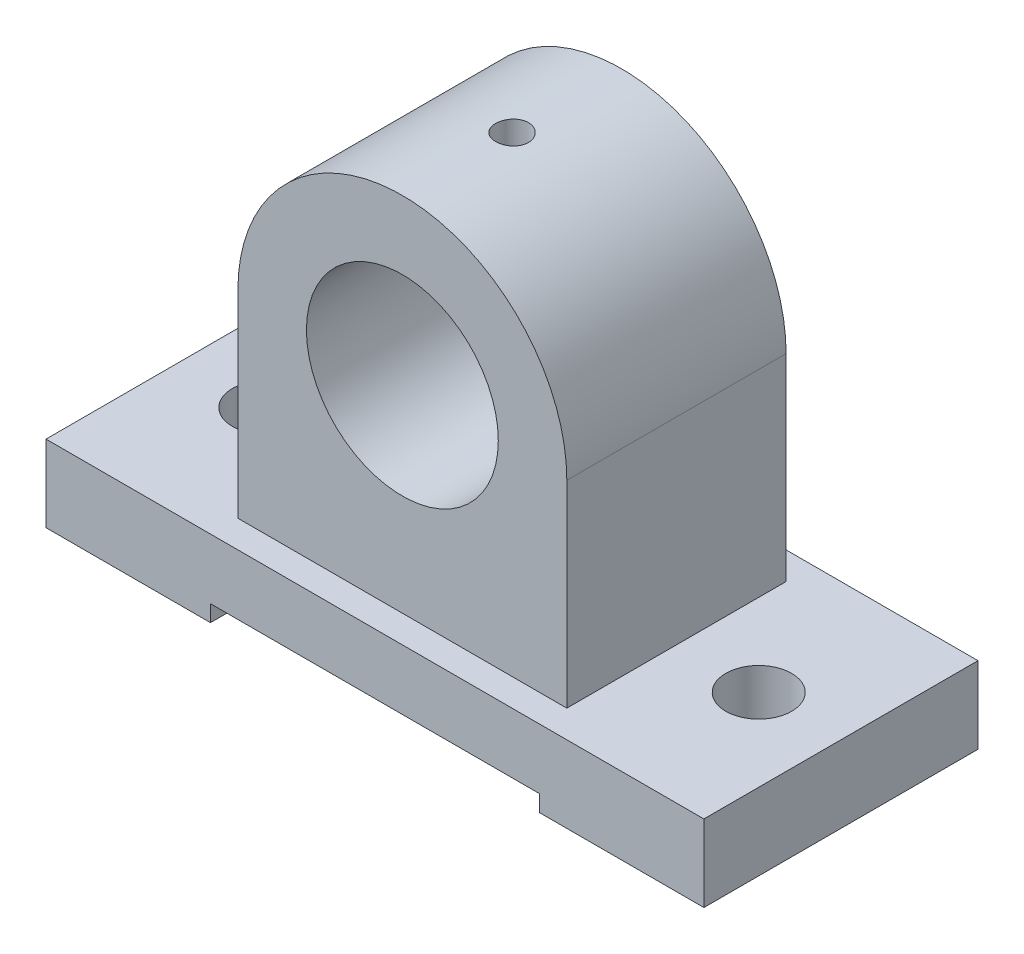
ISO-10303-21;
HEADER;
FILE_DESCRIPTION(('STEP AP214'),'2;1');
FILE_NAME('part.step','',(''),(''),'','','');
FILE_SCHEMA(('AUTOMOTIVE_DESIGN { 1 0 10303 214 1 1 1 1 }'));
ENDSEC;
DATA;
#1=APPLICATION_CONTEXT('core data for automotive mechanical design processes');
#2=APPLICATION_PROTOCOL_DEFINITION('international standard','automotive_design',2000,#1);
#3=PRODUCT_CONTEXT('',#1,'mechanical');
#4=PRODUCT('Part','Part','',(#3));
#5=PRODUCT_RELATED_PRODUCT_CATEGORY('part','',(#4));
#6=PRODUCT_DEFINITION_FORMATION('','',#4);
#7=PRODUCT_DEFINITION_CONTEXT('part definition',#1,'design');
#8=PRODUCT_DEFINITION('design','',#6,#7);
#9=PRODUCT_DEFINITION_SHAPE('','',#8);
#10=(LENGTH_UNIT() NAMED_UNIT(*) SI_UNIT(.MILLI.,.METRE.));
#11=(NAMED_UNIT(*) PLANE_ANGLE_UNIT() SI_UNIT($,.RADIAN.));
#12=(NAMED_UNIT(*) SI_UNIT($,.STERADIAN.) SOLID_ANGLE_UNIT());
#13=UNCERTAINTY_MEASURE_WITH_UNIT(LENGTH_MEASURE(1.E-05),#10,'distance_accuracy_value','');
#14=(GEOMETRIC_REPRESENTATION_CONTEXT(3) GLOBAL_UNCERTAINTY_ASSIGNED_CONTEXT((#13)) GLOBAL_UNIT_ASSIGNED_CONTEXT((#10,
#11,#12)) REPRESENTATION_CONTEXT('',''));
#15=CARTESIAN_POINT('',(0.,0.,0.));
#16=DIRECTION('',(0.,0.,1.));
#17=DIRECTION('',(1.,0.,0.));
#18=AXIS2_PLACEMENT_3D('',#15,#16,#17);
#19=CARTESIAN_POINT('',(60.,14.,25.));
#20=DIRECTION('',(0.,0.,-1.));
#21=DIRECTION('',(-1.,0.,0.));
#22=AXIS2_PLACEMENT_3D('',#19,#20,#21);
#23=PLANE('',#22);
#24=DIRECTION('',(0.,-1.,0.));
#25=VECTOR('',#24,1.);
#26=CARTESIAN_POINT('',(-30.,3.,25.));
#27=LINE('',#26,#25);
#28=CARTESIAN_POINT('',(-30.,3.,25.));
#29=VERTEX_POINT('',#28);
#30=CARTESIAN_POINT('',(-30.,0.,25.));
#31=VERTEX_POINT('',#30);
#32=EDGE_CURVE('E165',#29,#31,#27,.T.);
#33=ORIENTED_EDGE('',*,*,#32,.F.);
#34=DIRECTION('',(1.,0.,0.));
#35=VECTOR('',#34,1.);
#36=CARTESIAN_POINT('',(30.,3.,25.));
#37=LINE('',#36,#35);
#38=CARTESIAN_POINT('',(30.,3.,25.));
#39=VERTEX_POINT('',#38);
#40=EDGE_CURVE('E151',#29,#39,#37,.T.);
#41=ORIENTED_EDGE('',*,*,#40,.T.);
#42=DIRECTION('',(0.,-1.,0.));
#43=VECTOR('',#42,1.);
#44=CARTESIAN_POINT('',(30.,3.,25.));
#45=LINE('',#44,#43);
#46=CARTESIAN_POINT('',(30.,0.,25.));
#47=VERTEX_POINT('',#46);
#48=EDGE_CURVE('E176',#39,#47,#45,.T.);
#49=ORIENTED_EDGE('',*,*,#48,.T.);
#50=DIRECTION('',(1.,0.,0.));
#51=VECTOR('',#50,1.);
#52=CARTESIAN_POINT('',(60.,0.,25.));
#53=LINE('',#52,#51);
#54=CARTESIAN_POINT('',(60.,0.,25.));
#55=VERTEX_POINT('',#54);
#56=EDGE_CURVE('E247',#47,#55,#53,.T.);
#57=ORIENTED_EDGE('',*,*,#56,.T.);
#58=DIRECTION('',(0.,-1.,0.));
#59=VECTOR('',#58,1.);
#60=CARTESIAN_POINT('',(60.,14.,25.));
#61=LINE('',#60,#59);
#62=CARTESIAN_POINT('',(60.,14.,25.));
#63=VERTEX_POINT('',#62);
#64=EDGE_CURVE('E67',#63,#55,#61,.T.);
#65=ORIENTED_EDGE('',*,*,#64,.F.);
#66=DIRECTION('',(1.,0.,0.));
#67=VECTOR('',#66,1.);
#68=CARTESIAN_POINT('',(60.,14.,25.));
#69=LINE('',#68,#67);
#70=CARTESIAN_POINT('',(-60.,14.,25.));
#71=VERTEX_POINT('',#70);
#72=EDGE_CURVE('E234',#71,#63,#69,.T.);
#73=ORIENTED_EDGE('',*,*,#72,.F.);
#74=DIRECTION('',(0.,-1.,0.));
#75=VECTOR('',#74,1.);
#76=CARTESIAN_POINT('',(-60.,14.,25.));
#77=LINE('',#76,#75);
#78=CARTESIAN_POINT('',(-60.,0.,25.));
#79=VERTEX_POINT('',#78);
#80=EDGE_CURVE('E11',#71,#79,#77,.T.);
#81=ORIENTED_EDGE('',*,*,#80,.T.);
#82=EDGE_CURVE('E173',#79,#31,#53,.T.);
#83=ORIENTED_EDGE('',*,*,#82,.T.);
#84=EDGE_LOOP('',(#33,#41,#49,#57,#65,#73,#81,#83));
#85=FACE_BOUND('',#84,.T.);
#86=ADVANCED_FACE('F51',(#85),#23,.F.);
#87=CARTESIAN_POINT('',(-60.,14.,-25.));
#88=DIRECTION('',(0.,0.,1.));
#89=DIRECTION('',(1.,0.,0.));
#90=AXIS2_PLACEMENT_3D('',#87,#88,#89);
#91=PLANE('',#90);
#92=DIRECTION('',(0.,-1.,0.));
#93=VECTOR('',#92,1.);
#94=CARTESIAN_POINT('',(-30.,3.,-25.));
#95=LINE('',#94,#93);
#96=CARTESIAN_POINT('',(-30.,3.,-25.));
#97=VERTEX_POINT('',#96);
#98=CARTESIAN_POINT('',(-30.,0.,-25.));
#99=VERTEX_POINT('',#98);
#100=EDGE_CURVE('E168',#97,#99,#95,.T.);
#101=ORIENTED_EDGE('',*,*,#100,.T.);
#102=DIRECTION('',(-1.,0.,0.));
#103=VECTOR('',#102,1.);
#104=CARTESIAN_POINT('',(-60.,0.,-25.));
#105=LINE('',#104,#103);
#106=CARTESIAN_POINT('',(-60.,0.,-25.));
#107=VERTEX_POINT('',#106);
#108=EDGE_CURVE('E253',#99,#107,#105,.T.);
#109=ORIENTED_EDGE('',*,*,#108,.T.);
#110=DIRECTION('',(0.,-1.,0.));
#111=VECTOR('',#110,1.);
#112=CARTESIAN_POINT('',(-60.,14.,-25.));
#113=LINE('',#112,#111);
#114=CARTESIAN_POINT('',(-60.,14.,-25.));
#115=VERTEX_POINT('',#114);
#116=EDGE_CURVE('E243',#115,#107,#113,.T.);
#117=ORIENTED_EDGE('',*,*,#116,.F.);
#118=DIRECTION('',(-1.,0.,0.));
#119=VECTOR('',#118,1.);
#120=CARTESIAN_POINT('',(-60.,14.,-25.));
#121=LINE('',#120,#119);
#122=CARTESIAN_POINT('',(60.,14.,-25.));
#123=VERTEX_POINT('',#122);
#124=EDGE_CURVE('E240',#123,#115,#121,.T.);
#125=ORIENTED_EDGE('',*,*,#124,.F.);
#126=DIRECTION('',(0.,-1.,0.));
#127=VECTOR('',#126,1.);
#128=CARTESIAN_POINT('',(60.,14.,-25.));
#129=LINE('',#128,#127);
#130=CARTESIAN_POINT('',(60.,0.,-25.));
#131=VERTEX_POINT('',#130);
#132=EDGE_CURVE('E260',#123,#131,#129,.T.);
#133=ORIENTED_EDGE('',*,*,#132,.T.);
#134=CARTESIAN_POINT('',(30.,0.,-25.));
#135=VERTEX_POINT('',#134);
#136=EDGE_CURVE('E235',#131,#135,#105,.T.);
#137=ORIENTED_EDGE('',*,*,#136,.T.);
#138=DIRECTION('',(0.,-1.,0.));
#139=VECTOR('',#138,1.);
#140=CARTESIAN_POINT('',(30.,3.,-25.));
#141=LINE('',#140,#139);
#142=CARTESIAN_POINT('',(30.,3.,-25.));
#143=VERTEX_POINT('',#142);
#144=EDGE_CURVE('E75',#143,#135,#141,.T.);
#145=ORIENTED_EDGE('',*,*,#144,.F.);
#146=DIRECTION('',(-1.,0.,0.));
#147=VECTOR('',#146,1.);
#148=CARTESIAN_POINT('',(-30.,3.,-25.));
#149=LINE('',#148,#147);
#150=EDGE_CURVE('E301',#143,#97,#149,.T.);
#151=ORIENTED_EDGE('',*,*,#150,.T.);
#152=EDGE_LOOP('',(#101,#109,#117,#125,#133,#137,#145,#151));
#153=FACE_BOUND('',#152,.T.);
#154=ADVANCED_FACE('F278',(#153),#91,.F.);
#155=CARTESIAN_POINT('',(0.,0.,0.));
#156=DIRECTION('',(0.,-1.,0.));
#157=DIRECTION('',(0.,0.,-1.));
#158=AXIS2_PLACEMENT_3D('',#155,#156,#157);
#159=PLANE('',#158);
#160=CARTESIAN_POINT('',(-45.,0.,0.));
#161=DIRECTION('',(0.,1.,0.));
#162=DIRECTION('',(0.,0.,1.));
#163=AXIS2_PLACEMENT_3D('',#160,#161,#162);
#164=CIRCLE('',#163,6.);
#165=CARTESIAN_POINT('',(-45.,0.,6.));
#166=VERTEX_POINT('',#165);
#167=EDGE_CURVE('E292',#166,#166,#164,.T.);
#168=ORIENTED_EDGE('',*,*,#167,.T.);
#169=EDGE_LOOP('',(#168));
#170=FACE_BOUND('',#169,.T.);
#171=ORIENTED_EDGE('',*,*,#108,.F.);
#172=DIRECTION('',(0.,0.,1.));
#173=VECTOR('',#172,1.);
#174=CARTESIAN_POINT('',(-30.,0.,25.));
#175=LINE('',#174,#173);
#176=EDGE_CURVE('E290',#99,#31,#175,.T.);
#177=ORIENTED_EDGE('',*,*,#176,.T.);
#178=ORIENTED_EDGE('',*,*,#82,.F.);
#179=DIRECTION('',(0.,0.,1.));
#180=VECTOR('',#179,1.);
#181=CARTESIAN_POINT('',(-60.,0.,25.));
#182=LINE('',#181,#180);
#183=EDGE_CURVE('E229',#107,#79,#182,.T.);
#184=ORIENTED_EDGE('',*,*,#183,.F.);
#185=EDGE_LOOP('',(#171,#177,#178,#184));
#186=FACE_BOUND('',#185,.T.);
#187=ADVANCED_FACE('F289',(#170,#186),#159,.T.);
#188=CARTESIAN_POINT('',(45.,0.,0.));
#189=DIRECTION('',(0.,1.,0.));
#190=DIRECTION('',(0.,0.,1.));
#191=AXIS2_PLACEMENT_3D('',#188,#189,#190);
#192=CIRCLE('',#191,6.);
#193=CARTESIAN_POINT('',(45.,0.,6.));
#194=VERTEX_POINT('',#193);
#195=EDGE_CURVE('E309',#194,#194,#192,.T.);
#196=ORIENTED_EDGE('',*,*,#195,.T.);
#197=EDGE_LOOP('',(#196));
#198=FACE_BOUND('',#197,.T.);
#199=ORIENTED_EDGE('',*,*,#56,.F.);
#200=DIRECTION('',(0.,0.,-1.));
#201=VECTOR('',#200,1.);
#202=CARTESIAN_POINT('',(30.,0.,-25.));
#203=LINE('',#202,#201);
#204=EDGE_CURVE('E170',#47,#135,#203,.T.);
#205=ORIENTED_EDGE('',*,*,#204,.T.);
#206=ORIENTED_EDGE('',*,*,#136,.F.);
#207=DIRECTION('',(0.,0.,-1.));
#208=VECTOR('',#207,1.);
#209=CARTESIAN_POINT('',(60.,0.,-25.));
#210=LINE('',#209,#208);
#211=EDGE_CURVE('E250',#55,#131,#210,.T.);
#212=ORIENTED_EDGE('',*,*,#211,.F.);
#213=EDGE_LOOP('',(#199,#205,#206,#212));
#214=FACE_BOUND('',#213,.T.);
#215=ADVANCED_FACE('F276',(#198,#214),#159,.T.);
#216=CARTESIAN_POINT('',(-60.,14.,25.));
#217=DIRECTION('',(1.,0.,0.));
#218=DIRECTION('',(0.,0.,-1.));
#219=AXIS2_PLACEMENT_3D('',#216,#217,#218);
#220=PLANE('',#219);
#221=ORIENTED_EDGE('',*,*,#183,.T.);
#222=ORIENTED_EDGE('',*,*,#80,.F.);
#223=DIRECTION('',(0.,0.,1.));
#224=VECTOR('',#223,1.);
#225=CARTESIAN_POINT('',(-60.,14.,25.));
#226=LINE('',#225,#224);
#227=EDGE_CURVE('E230',#115,#71,#226,.T.);
#228=ORIENTED_EDGE('',*,*,#227,.F.);
#229=ORIENTED_EDGE('',*,*,#116,.T.);
#230=EDGE_LOOP('',(#221,#222,#228,#229));
#231=FACE_BOUND('',#230,.T.);
#232=ADVANCED_FACE('F54',(#231),#220,.F.);
#233=CARTESIAN_POINT('',(60.,14.,-25.));
#234=DIRECTION('',(-1.,0.,0.));
#235=DIRECTION('',(0.,0.,1.));
#236=AXIS2_PLACEMENT_3D('',#233,#234,#235);
#237=PLANE('',#236);
#238=ORIENTED_EDGE('',*,*,#211,.T.);
#239=ORIENTED_EDGE('',*,*,#132,.F.);
#240=DIRECTION('',(0.,0.,-1.));
#241=VECTOR('',#240,1.);
#242=CARTESIAN_POINT('',(60.,14.,-25.));
#243=LINE('',#242,#241);
#244=EDGE_CURVE('E237',#63,#123,#243,.T.);
#245=ORIENTED_EDGE('',*,*,#244,.F.);
#246=ORIENTED_EDGE('',*,*,#64,.T.);
#247=EDGE_LOOP('',(#238,#239,#245,#246));
#248=FACE_BOUND('',#247,.T.);
#249=ADVANCED_FACE('F271',(#248),#237,.F.);
#250=CARTESIAN_POINT('',(0.,14.,0.));
#251=DIRECTION('',(0.,-1.,0.));
#252=DIRECTION('',(0.,0.,-1.));
#253=AXIS2_PLACEMENT_3D('',#250,#251,#252);
#254=PLANE('',#253);
#255=CARTESIAN_POINT('',(-45.,14.,0.));
#256=DIRECTION('',(0.,1.,0.));
#257=DIRECTION('',(0.,0.,1.));
#258=AXIS2_PLACEMENT_3D('',#255,#256,#257);
#259=CIRCLE('',#258,6.);
#260=CARTESIAN_POINT('',(-45.,14.,6.));
#261=VERTEX_POINT('',#260);
#262=EDGE_CURVE('E298',#261,#261,#259,.T.);
#263=ORIENTED_EDGE('',*,*,#262,.F.);
#264=EDGE_LOOP('',(#263));
#265=FACE_BOUND('',#264,.T.);
#266=CARTESIAN_POINT('',(45.,14.,0.));
#267=DIRECTION('',(0.,1.,0.));
#268=DIRECTION('',(0.,0.,1.));
#269=AXIS2_PLACEMENT_3D('',#266,#267,#268);
#270=CIRCLE('',#269,6.);
#271=CARTESIAN_POINT('',(45.,14.,6.));
#272=VERTEX_POINT('',#271);
#273=EDGE_CURVE('E312',#272,#272,#270,.T.);
#274=ORIENTED_EDGE('',*,*,#273,.F.);
#275=EDGE_LOOP('',(#274));
#276=FACE_BOUND('',#275,.T.);
#277=DIRECTION('',(0.,0.,-1.));
#278=VECTOR('',#277,1.);
#279=CARTESIAN_POINT('',(-30.,14.,20.));
#280=LINE('',#279,#278);
#281=CARTESIAN_POINT('',(-30.,14.,20.));
#282=VERTEX_POINT('',#281);
#283=CARTESIAN_POINT('',(-30.,14.,-20.));
#284=VERTEX_POINT('',#283);
#285=EDGE_CURVE('E204',#282,#284,#280,.T.);
#286=ORIENTED_EDGE('',*,*,#285,.T.);
#287=DIRECTION('',(1.,0.,0.));
#288=VECTOR('',#287,1.);
#289=CARTESIAN_POINT('',(30.,14.,-20.));
#290=LINE('',#289,#288);
#291=CARTESIAN_POINT('',(30.,14.,-20.));
#292=VERTEX_POINT('',#291);
#293=EDGE_CURVE('E83',#284,#292,#290,.T.);
#294=ORIENTED_EDGE('',*,*,#293,.T.);
#295=DIRECTION('',(0.,0.,-1.));
#296=VECTOR('',#295,1.);
#297=CARTESIAN_POINT('',(30.,14.,20.));
#298=LINE('',#297,#296);
#299=CARTESIAN_POINT('',(30.,14.,20.));
#300=VERTEX_POINT('',#299);
#301=EDGE_CURVE('E225',#300,#292,#298,.T.);
#302=ORIENTED_EDGE('',*,*,#301,.F.);
#303=DIRECTION('',(1.,0.,0.));
#304=VECTOR('',#303,1.);
#305=CARTESIAN_POINT('',(30.,14.,20.));
#306=LINE('',#305,#304);
#307=EDGE_CURVE('E190',#282,#300,#306,.T.);
#308=ORIENTED_EDGE('',*,*,#307,.F.);
#309=EDGE_LOOP('',(#286,#294,#302,#308));
#310=FACE_BOUND('',#309,.T.);
#311=ORIENTED_EDGE('',*,*,#227,.T.);
#312=ORIENTED_EDGE('',*,*,#72,.T.);
#313=ORIENTED_EDGE('',*,*,#244,.T.);
#314=ORIENTED_EDGE('',*,*,#124,.T.);
#315=EDGE_LOOP('',(#311,#312,#313,#314));
#316=FACE_BOUND('',#315,.T.);
#317=ADVANCED_FACE('F283',(#265,#276,#310,#316),#254,.F.);
#318=CARTESIAN_POINT('',(30.,50.,20.));
#319=DIRECTION('',(-1.,0.,0.));
#320=DIRECTION('',(0.,0.,1.));
#321=AXIS2_PLACEMENT_3D('',#318,#319,#320);
#322=PLANE('',#321);
#323=DIRECTION('',(0.,1.,0.));
#324=VECTOR('',#323,1.);
#325=CARTESIAN_POINT('',(30.,50.,-20.));
#326=LINE('',#325,#324);
#327=CARTESIAN_POINT('',(30.,50.,-20.));
#328=VERTEX_POINT('',#327);
#329=EDGE_CURVE('E207',#292,#328,#326,.T.);
#330=ORIENTED_EDGE('',*,*,#329,.T.);
#331=DIRECTION('',(0.,0.,-1.));
#332=VECTOR('',#331,1.);
#333=CARTESIAN_POINT('',(30.,50.,20.));
#334=LINE('',#333,#332);
#335=CARTESIAN_POINT('',(30.,50.,20.));
#336=VERTEX_POINT('',#335);
#337=EDGE_CURVE('E221',#336,#328,#334,.T.);
#338=ORIENTED_EDGE('',*,*,#337,.F.);
#339=DIRECTION('',(0.,1.,0.));
#340=VECTOR('',#339,1.);
#341=CARTESIAN_POINT('',(30.,50.,20.));
#342=LINE('',#341,#340);
#343=EDGE_CURVE('E194',#300,#336,#342,.T.);
#344=ORIENTED_EDGE('',*,*,#343,.F.);
#345=ORIENTED_EDGE('',*,*,#301,.T.);
#346=EDGE_LOOP('',(#330,#338,#344,#345));
#347=FACE_BOUND('',#346,.T.);
#348=ADVANCED_FACE('F344',(#347),#322,.F.);
#349=CARTESIAN_POINT('',(0.,50.,20.));
#350=DIRECTION('',(0.,0.,-1.));
#351=DIRECTION('',(-1.,0.,0.));
#352=AXIS2_PLACEMENT_3D('',#349,#350,#351);
#353=CYLINDRICAL_SURFACE('',#352,30.);
#354=CARTESIAN_POINT('',(0.,80.,3.));
#355=CARTESIAN_POINT('',(-0.16806106137467,79.9999980656231,2.99999272229886));
#356=CARTESIAN_POINT('',(-0.336233235503318,79.9985727678862,2.98583019331067));
#357=CARTESIAN_POINT('',(-0.667915195490509,79.9930240278421,2.92954688912872));
#358=CARTESIAN_POINT('',(-0.831419637506482,79.9888976130208,2.88739531192623));
#359=CARTESIAN_POINT('',(-1.14891502636024,79.9784124368921,2.7763732782065));
#360=CARTESIAN_POINT('',(-1.30291165384473,79.9720550240212,2.70751895844458));
#361=CARTESIAN_POINT('',(-1.59712848288122,79.9578187218292,2.54507727620507));
#362=CARTESIAN_POINT('',(-1.73735141633723,79.9499401351439,2.45149483199959));
#363=CARTESIAN_POINT('',(-2.00057865202225,79.9335123302397,2.24189190701318));
#364=CARTESIAN_POINT('',(-2.12352643450468,79.924961047216,2.1258006017939));
#365=CARTESIAN_POINT('',(-2.34822756429295,79.9081687071879,1.87462639721091));
#366=CARTESIAN_POINT('',(-2.44997993124796,79.8999276645475,1.73954261987284));
#367=CARTESIAN_POINT('',(-2.62960191133085,79.8846677465835,1.45386440494914));
#368=CARTESIAN_POINT('',(-2.70742039636464,79.8776515013272,1.30323766771542));
#369=CARTESIAN_POINT('',(-2.83663915422828,79.8656611263957,0.990973242285064));
#370=CARTESIAN_POINT('',(-2.88804007977387,79.8606869462667,0.829335826248151));
#371=CARTESIAN_POINT('',(-2.96279712480568,79.8533625221893,0.500214597401972));
#372=CARTESIAN_POINT('',(-2.98624695901139,79.8510035119429,0.332752269443376));
#373=CARTESIAN_POINT('',(-3.00472585540608,79.8491492918158,-0.0037465901873406));
#374=CARTESIAN_POINT('',(-2.9997556646124,79.8496540066624,-0.172783080366177));
#375=CARTESIAN_POINT('',(-2.96161284075803,79.853462206968,-0.506985929079954));
#376=CARTESIAN_POINT('',(-2.92854253237366,79.8567555377195,-0.672164097986082));
#377=CARTESIAN_POINT('',(-2.83529743245176,79.8657540286226,-0.994613889603282));
#378=CARTESIAN_POINT('',(-2.77512227476724,79.8714592213548,-1.15188540547509));
#379=CARTESIAN_POINT('',(-2.62926268164452,79.8846502835621,-1.45438076189667));
#380=CARTESIAN_POINT('',(-2.54353284815994,79.8921393172447,-1.59958256846795));
#381=CARTESIAN_POINT('',(-2.34903008205968,79.9080515519863,-1.87357564473565));
#382=CARTESIAN_POINT('',(-2.24025647500952,79.9164747803835,-2.00236643394529));
#383=CARTESIAN_POINT('',(-2.00218233723621,79.9333515593897,-2.24047618196708));
#384=CARTESIAN_POINT('',(-1.87279343655409,79.9418050799899,-2.34970680564241));
#385=CARTESIAN_POINT('',(-1.59746844521134,79.9577548723555,-2.54491089873116));
#386=CARTESIAN_POINT('',(-1.4515323359988,79.9652511430477,-2.63088434206943));
#387=CARTESIAN_POINT('',(-1.14719431707709,79.9784442700129,-2.77713006093076));
#388=CARTESIAN_POINT('',(-0.988790239169711,79.9841408124431,-2.83739785445418));
#389=CARTESIAN_POINT('',(-0.664041651989797,79.9930894232423,-2.93045675013526));
#390=CARTESIAN_POINT('',(-0.497697380329802,79.9963415647119,-2.96324867397187));
#391=CARTESIAN_POINT('',(-0.162555297275712,80.0000255500493,-3.0003129232043));
#392=CARTESIAN_POINT('',(0.00622890631647515,80.0004694480321,-3.0047071447575));
#393=CARTESIAN_POINT('',(0.342131379947099,79.9985192527039,-2.98517141085371));
#394=CARTESIAN_POINT('',(0.509249672461409,79.9961251977341,-2.96124183805416));
#395=CARTESIAN_POINT('',(0.836724620504023,79.9887758461758,-2.88583891373527));
#396=CARTESIAN_POINT('',(0.997094546916056,79.9838258575412,-2.83442263656597));
#397=CARTESIAN_POINT('',(1.30693296415134,79.9719199658183,-2.70556447788819));
#398=CARTESIAN_POINT('',(1.45640121047135,79.9649640177576,-2.62812201288181));
#399=CARTESIAN_POINT('',(1.74074454051643,79.9497942599127,-2.44910748400826));
#400=CARTESIAN_POINT('',(1.87556897924675,79.9415763081032,-2.34745533322255));
#401=CARTESIAN_POINT('',(2.12628486993563,79.9248179860856,-2.12302179677722));
#402=CARTESIAN_POINT('',(2.24217584654753,79.9162776077891,-2.00023988078905));
#403=CARTESIAN_POINT('',(2.45215832966144,79.8998007242226,-1.736500276023));
#404=CARTESIAN_POINT('',(2.54616983603863,79.8918665041693,-1.59547873037213));
#405=CARTESIAN_POINT('',(2.70917477623148,79.8775349738267,-1.29957791955995));
#406=CARTESIAN_POINT('',(2.77816855216165,79.8711376425211,-1.14469884393481));
#407=CARTESIAN_POINT('',(2.88904562605342,79.8606184290215,-0.825753781602618));
#408=CARTESIAN_POINT('',(2.93097652443558,79.8564925534937,-0.661704479726639));
#409=CARTESIAN_POINT('',(2.98669202138839,79.8509709584863,-0.328850406117685));
#410=CARTESIAN_POINT('',(3.00047742719855,79.8495751607056,-0.160045770912979));
#411=CARTESIAN_POINT('',(2.99949941541377,79.8496733932269,0.176732065070113));
#412=CARTESIAN_POINT('',(2.98486166877934,79.8511547026103,0.344705648648444));
#413=CARTESIAN_POINT('',(2.92771635889096,79.8568131166864,0.675794751504863));
#414=CARTESIAN_POINT('',(2.88520876428648,79.8609902244116,0.838910265317938));
#415=CARTESIAN_POINT('',(2.77356505889251,79.8715660478956,1.15565204714357));
#416=CARTESIAN_POINT('',(2.70443263302275,79.8779644562108,1.30927962488917));
#417=CARTESIAN_POINT('',(2.54151466473313,79.8922625551807,1.6027706750131));
#418=CARTESIAN_POINT('',(2.44772926036624,79.9001622374285,1.74263422446189));
#419=CARTESIAN_POINT('',(2.23769566885599,79.9166146162909,2.00527102341581));
#420=CARTESIAN_POINT('',(2.12135384667081,79.9251699418025,2.12796922910126));
#421=CARTESIAN_POINT('',(1.86969509767533,79.9419456418635,2.35215669809897));
#422=CARTESIAN_POINT('',(1.73437363232477,79.9501659356893,2.45364087407151));
#423=CARTESIAN_POINT('',(1.44822430248387,79.9653668620748,2.63272036156386));
#424=CARTESIAN_POINT('',(1.29735824804029,79.9723443208044,2.71025487283555));
#425=CARTESIAN_POINT('',(0.984774837301653,79.9842388774969,2.8387872684716));
#426=CARTESIAN_POINT('',(0.823069949476829,79.9891582972896,2.88981507286064));
#427=CARTESIAN_POINT('',(0.550374784217114,79.995146413212,2.9511618512544));
#428=CARTESIAN_POINT('',(0.441127658533528,79.996958020755,2.96945113289807));
#429=CARTESIAN_POINT('',(0.22126974245194,79.9993854485236,2.99387257818529));
#430=CARTESIAN_POINT('',(0.110658957679675,80.0000012736807,3.00000479196559));
#431=CARTESIAN_POINT('',(0.,80.,3.));
#432=B_SPLINE_CURVE_WITH_KNOTS('',3,(#354,#355,#356,#357,#358,#359,#360,#361,#362,#363,#364,
#365,#366,#367,#368,#369,#370,#371,#372,#373,#374,#375,#376,#377,#378,#379,#380,#381,#382,#383,
#384,#385,#386,#387,#388,#389,#390,#391,#392,#393,#394,#395,#396,#397,#398,#399,#400,#401,#402,
#403,#404,#405,#406,#407,#408,#409,#410,#411,#412,#413,#414,#415,#416,#417,#418,#419,#420,#421,
#422,#423,#424,#425,#426,#427,#428,#429,#430,#431),.UNSPECIFIED.,.T.,.F.,(4,2,2,2,2,2,2,2,2,2,2,
2,2,2,2,2,2,2,2,2,2,2,2,2,2,2,2,2,2,2,2,2,2,2,2,2,2,2,4),(0.,0.503779098805421,1.00811352850646,
1.51214365719661,2.01607361274835,2.52161570586884,3.02718117662118,3.53381926416665,
4.04044483327512,4.5453669613559,5.0502758176733,5.55335392323331,6.05643882484901,
6.56042284118684,7.06442160993376,7.57064202588619,8.07686300939315,8.58317222080744,
9.08946629026318,9.59358565823273,10.0976982155743,10.6007680588291,11.103849181484,
11.608618222461,12.1133999343069,12.619999308258,13.1265917542612,13.6322907177901,
14.1379751771876,14.6414288788187,15.1448831467812,15.648267760884,16.1516495561688,
16.6571675228296,17.1628065791087,17.6697189307873,18.1760578438588,18.5077700169705,
18.8394808220708),.UNSPECIFIED.);
#433=CARTESIAN_POINT('',(0.,80.,3.));
#434=VERTEX_POINT('',#433);
#435=EDGE_CURVE('E307',#434,#434,#432,.T.);
#436=ORIENTED_EDGE('',*,*,#435,.T.);
#437=EDGE_LOOP('',(#436));
#438=FACE_BOUND('',#437,.T.);
#439=CARTESIAN_POINT('',(0.,50.,-20.));
#440=DIRECTION('',(0.,0.,1.));
#441=DIRECTION('',(-1.,0.,0.));
#442=AXIS2_PLACEMENT_3D('',#439,#440,#441);
#443=CIRCLE('',#442,30.);
#444=CARTESIAN_POINT('',(-30.,50.,-20.));
#445=VERTEX_POINT('',#444);
#446=EDGE_CURVE('E210',#328,#445,#443,.T.);
#447=ORIENTED_EDGE('',*,*,#446,.T.);
#448=DIRECTION('',(0.,0.,-1.));
#449=VECTOR('',#448,1.);
#450=CARTESIAN_POINT('',(-30.,50.,20.));
#451=LINE('',#450,#449);
#452=CARTESIAN_POINT('',(-30.,50.,20.));
#453=VERTEX_POINT('',#452);
#454=EDGE_CURVE('E218',#453,#445,#451,.T.);
#455=ORIENTED_EDGE('',*,*,#454,.F.);
#456=CARTESIAN_POINT('',(0.,50.,20.));
#457=DIRECTION('',(0.,0.,1.));
#458=DIRECTION('',(-1.,0.,0.));
#459=AXIS2_PLACEMENT_3D('',#456,#457,#458);
#460=CIRCLE('',#459,30.);
#461=EDGE_CURVE('E198',#336,#453,#460,.T.);
#462=ORIENTED_EDGE('',*,*,#461,.F.);
#463=ORIENTED_EDGE('',*,*,#337,.T.);
#464=EDGE_LOOP('',(#447,#455,#462,#463));
#465=FACE_BOUND('',#464,.T.);
#466=ADVANCED_FACE('F340',(#438,#465),#353,.T.);
#467=CARTESIAN_POINT('',(-30.,14.,20.));
#468=DIRECTION('',(1.,0.,0.));
#469=DIRECTION('',(0.,0.,-1.));
#470=AXIS2_PLACEMENT_3D('',#467,#468,#469);
#471=PLANE('',#470);
#472=DIRECTION('',(0.,-1.,0.));
#473=VECTOR('',#472,1.);
#474=CARTESIAN_POINT('',(-30.,14.,-20.));
#475=LINE('',#474,#473);
#476=EDGE_CURVE('E195',#445,#284,#475,.T.);
#477=ORIENTED_EDGE('',*,*,#476,.T.);
#478=ORIENTED_EDGE('',*,*,#285,.F.);
#479=DIRECTION('',(0.,-1.,0.));
#480=VECTOR('',#479,1.);
#481=CARTESIAN_POINT('',(-30.,14.,20.));
#482=LINE('',#481,#480);
#483=EDGE_CURVE('E201',#453,#282,#482,.T.);
#484=ORIENTED_EDGE('',*,*,#483,.F.);
#485=ORIENTED_EDGE('',*,*,#454,.T.);
#486=EDGE_LOOP('',(#477,#478,#484,#485));
#487=FACE_BOUND('',#486,.T.);
#488=ADVANCED_FACE('F343',(#487),#471,.F.);
#489=CARTESIAN_POINT('',(0.,50.,20.));
#490=DIRECTION('',(0.,0.,-1.));
#491=DIRECTION('',(-1.,0.,0.));
#492=AXIS2_PLACEMENT_3D('',#489,#490,#491);
#493=PLANE('',#492);
#494=CARTESIAN_POINT('',(0.,50.,20.));
#495=DIRECTION('',(0.,0.,-1.));
#496=DIRECTION('',(-1.,0.,0.));
#497=AXIS2_PLACEMENT_3D('',#494,#495,#496);
#498=CIRCLE('',#497,17.5);
#499=CARTESIAN_POINT('',(-17.5,50.,20.));
#500=VERTEX_POINT('',#499);
#501=EDGE_CURVE('E182',#500,#500,#498,.T.);
#502=ORIENTED_EDGE('',*,*,#501,.T.);
#503=EDGE_LOOP('',(#502));
#504=FACE_BOUND('',#503,.T.);
#505=ORIENTED_EDGE('',*,*,#307,.T.);
#506=ORIENTED_EDGE('',*,*,#343,.T.);
#507=ORIENTED_EDGE('',*,*,#461,.T.);
#508=ORIENTED_EDGE('',*,*,#483,.T.);
#509=EDGE_LOOP('',(#505,#506,#507,#508));
#510=FACE_BOUND('',#509,.T.);
#511=ADVANCED_FACE('F355',(#504,#510),#493,.F.);
#512=CARTESIAN_POINT('',(0.,50.,-20.));
#513=DIRECTION('',(0.,0.,-1.));
#514=DIRECTION('',(-1.,0.,0.));
#515=AXIS2_PLACEMENT_3D('',#512,#513,#514);
#516=PLANE('',#515);
#517=CARTESIAN_POINT('',(0.,50.,-20.));
#518=DIRECTION('',(0.,0.,-1.));
#519=DIRECTION('',(-1.,0.,0.));
#520=AXIS2_PLACEMENT_3D('',#517,#518,#519);
#521=CIRCLE('',#520,17.5);
#522=CARTESIAN_POINT('',(-17.5,50.,-20.));
#523=VERTEX_POINT('',#522);
#524=EDGE_CURVE('E175',#523,#523,#521,.T.);
#525=ORIENTED_EDGE('',*,*,#524,.F.);
#526=EDGE_LOOP('',(#525));
#527=FACE_BOUND('',#526,.T.);
#528=ORIENTED_EDGE('',*,*,#293,.F.);
#529=ORIENTED_EDGE('',*,*,#476,.F.);
#530=ORIENTED_EDGE('',*,*,#446,.F.);
#531=ORIENTED_EDGE('',*,*,#329,.F.);
#532=EDGE_LOOP('',(#528,#529,#530,#531));
#533=FACE_BOUND('',#532,.T.);
#534=ADVANCED_FACE('F353',(#527,#533),#516,.T.);
#535=CARTESIAN_POINT('',(0.,50.,-25.));
#536=DIRECTION('',(0.,0.,1.));
#537=DIRECTION('',(1.,0.,0.));
#538=AXIS2_PLACEMENT_3D('',#535,#536,#537);
#539=CYLINDRICAL_SURFACE('',#538,17.5);
#540=CARTESIAN_POINT('',(0.,67.5,3.));
#541=CARTESIAN_POINT('',(0.167197888477242,67.4999970906634,2.99999336002777));
#542=CARTESIAN_POINT('',(0.334485258143131,67.4975789341583,2.9859752108854));
#543=CARTESIAN_POINT('',(0.664363255770977,67.4881653307871,2.9302990995645));
#544=CARTESIAN_POINT('',(0.826949503842277,67.4811657504724,2.88861617722034));
#545=CARTESIAN_POINT('',(1.14260529013332,67.4633739362553,2.77891008604766));
#546=CARTESIAN_POINT('',(1.29568266742598,67.4525848765595,2.7109089574683));
#547=CARTESIAN_POINT('',(1.58823673724716,67.4283986081642,2.55055555976633));
#548=CARTESIAN_POINT('',(1.72771488279891,67.4150016785645,2.45820589610097));
#549=CARTESIAN_POINT('',(1.99053687981521,67.3869322580543,2.25078614716181));
#550=CARTESIAN_POINT('',(2.11372361591322,67.3722493384791,2.13551837087062));
#551=CARTESIAN_POINT('',(2.33910834882426,67.3433420797551,1.88595990137049));
#552=CARTESIAN_POINT('',(2.44130498247174,67.3291177704403,1.75166797362762));
#553=CARTESIAN_POINT('',(2.62244343427672,67.3026372057527,1.46678711062376));
#554=CARTESIAN_POINT('',(2.70122890432628,67.2903944202576,1.31609740156248));
#555=CARTESIAN_POINT('',(2.8323085511595,67.2694082884627,1.00337737292835));
#556=CARTESIAN_POINT('',(2.88460462423909,67.2606646916761,0.841347866082795));
#557=CARTESIAN_POINT('',(2.96072391561323,67.2477710031912,0.512216683497005));
#558=CARTESIAN_POINT('',(2.98481900474365,67.243577079757,0.345179634158691));
#559=CARTESIAN_POINT('',(3.00469550116558,67.2401251006059,0.00938486508187569));
#560=CARTESIAN_POINT('',(3.00047902833606,67.2408666753347,-0.159372724883304));
#561=CARTESIAN_POINT('',(2.9640733197104,67.2471619087271,-0.491871139844601));
#562=CARTESIAN_POINT('',(2.93219030257035,67.2526628874287,-0.655646636178513));
#563=CARTESIAN_POINT('',(2.84183747786595,67.2677745842644,-0.975488916428064));
#564=CARTESIAN_POINT('',(2.78336671037819,67.2773854507809,-1.13155542179294));
#565=CARTESIAN_POINT('',(2.64119011069865,67.2996905267923,-1.43246174324675));
#566=CARTESIAN_POINT('',(2.55735789103785,67.3124001155707,-1.57724065502486));
#567=CARTESIAN_POINT('',(2.36692773155713,67.3394600238194,-1.85079247024585));
#568=CARTESIAN_POINT('',(2.26032785038532,67.3538104831548,-1.97956400729042));
#569=CARTESIAN_POINT('',(2.02572372299599,67.3827662542506,-2.21921755595085));
#570=CARTESIAN_POINT('',(1.89745691927206,67.3973724389321,-2.32984259754192));
#571=CARTESIAN_POINT('',(1.62404588495939,67.425020040751,-2.52803945123165));
#572=CARTESIAN_POINT('',(1.47890153361698,67.4380614466915,-2.61561109837572));
#573=CARTESIAN_POINT('',(1.17560813403869,67.4611302114515,-2.76524184909041));
#574=CARTESIAN_POINT('',(1.01744722776392,67.4711547823576,-2.82727737360572));
#575=CARTESIAN_POINT('',(0.692740844795709,67.4870382024854,-2.9238318026769));
#576=CARTESIAN_POINT('',(0.526196112090004,67.4928974206486,-2.95835314430384));
#577=CARTESIAN_POINT('',(0.19166362094677,67.4997401167391,-2.99854888489858));
#578=CARTESIAN_POINT('',(0.023719408168771,67.5007831904569,-3.00457589999581));
#579=CARTESIAN_POINT('',(-0.310778590563212,67.4980396044024,-2.98855325145464));
#580=CARTESIAN_POINT('',(-0.477332432950723,67.4942531416242,-2.96650473300188));
#581=CARTESIAN_POINT('',(-0.803226267811296,67.4823128742762,-2.8952501678744));
#582=CARTESIAN_POINT('',(-0.962605737440308,67.474187289333,-2.84621953805802));
#583=CARTESIAN_POINT('',(-1.27088253097933,67.4544761572207,-2.72258016702585));
#584=CARTESIAN_POINT('',(-1.41977923763671,67.4428904065181,-2.64796992113086));
#585=CARTESIAN_POINT('',(-1.70438969290455,67.417396034143,-2.47448758312578));
#586=CARTESIAN_POINT('',(-1.83996793782045,67.4034668086373,-2.37539627431762));
#587=CARTESIAN_POINT('',(-2.09269752640408,67.374890575826,-2.15606511767561));
#588=CARTESIAN_POINT('',(-2.20984744764914,67.3602435132271,-2.0358236388444));
#589=CARTESIAN_POINT('',(-2.42370922919042,67.3316886120673,-1.77602051143289));
#590=CARTESIAN_POINT('',(-2.52018230406535,67.3177906676551,-1.63626104120146));
#591=CARTESIAN_POINT('',(-2.68828177195729,67.2924954044816,-1.34231277339394));
#592=CARTESIAN_POINT('',(-2.75990898496466,67.2810980031992,-1.1881244522279));
#593=CARTESIAN_POINT('',(-2.87593039066209,67.2621692769636,-0.870349519704501));
#594=CARTESIAN_POINT('',(-2.92044137511779,67.2546213950509,-0.706806580821891));
#595=CARTESIAN_POINT('',(-2.98133287310577,67.2442055530579,-0.374424534192308));
#596=CARTESIAN_POINT('',(-2.99771598859209,67.2413371601052,-0.205585917790713));
#597=CARTESIAN_POINT('',(-3.00181092557774,67.2406244562008,0.130208811389107));
#598=CARTESIAN_POINT('',(-2.98989876393497,67.2427142552452,0.297160317320664));
#599=CARTESIAN_POINT('',(-2.93855658141656,67.2515376902196,0.626645516275726));
#600=CARTESIAN_POINT('',(-2.89912666495964,67.2582713085283,0.789179226060541));
#601=CARTESIAN_POINT('',(-2.79401555437729,67.2755980335454,1.10505721850842));
#602=CARTESIAN_POINT('',(-2.72836856938937,67.2861861092089,1.25841317801403));
#603=CARTESIAN_POINT('',(-2.57272591738777,67.3100332980519,1.55199555431465));
#604=CARTESIAN_POINT('',(-2.4827289285662,67.3232925562231,1.6922212577946));
#605=CARTESIAN_POINT('',(-2.27960652854412,67.3511960758331,1.95745891026577));
#606=CARTESIAN_POINT('',(-2.1662051126384,67.3658556265499,2.08225791456266));
#607=CARTESIAN_POINT('',(-1.92007371238759,67.3947877125717,2.31118326116821));
#608=CARTESIAN_POINT('',(-1.78733928025448,67.4090601579197,2.41530483332687));
#609=CARTESIAN_POINT('',(-1.50514767837312,67.4357318551825,2.6006229221308));
#610=CARTESIAN_POINT('',(-1.35557476659935,67.4481165680147,2.68164531379999));
#611=CARTESIAN_POINT('',(-1.04478686777411,67.4694759066054,2.81728768360264));
#612=CARTESIAN_POINT('',(-0.883583513020673,67.4784538848809,2.8719336328885));
#613=CARTESIAN_POINT('',(-0.601487930679763,67.4900568902174,2.94157686709655));
#614=CARTESIAN_POINT('',(-0.482290496810162,67.4937653830011,2.96344994889187));
#615=CARTESIAN_POINT('',(-0.242077656560215,67.4987379681287,2.99266378225941));
#616=CARTESIAN_POINT('',(-0.121062284493385,67.5000021065514,3.00000480777727));
#617=CARTESIAN_POINT('',(0.,67.5,3.));
#618=B_SPLINE_CURVE_WITH_KNOTS('',3,(#540,#541,#542,#543,#544,#545,#546,#547,#548,#549,#550,
#551,#552,#553,#554,#555,#556,#557,#558,#559,#560,#561,#562,#563,#564,#565,#566,#567,#568,#569,
#570,#571,#572,#573,#574,#575,#576,#577,#578,#579,#580,#581,#582,#583,#584,#585,#586,#587,#588,
#589,#590,#591,#592,#593,#594,#595,#596,#597,#598,#599,#600,#601,#602,#603,#604,#605,#606,#607,
#608,#609,#610,#611,#612,#613,#614,#615,#616,#617),.UNSPECIFIED.,.T.,.F.,(4,2,2,2,2,2,2,2,2,2,2,
2,2,2,2,2,2,2,2,2,2,2,2,2,2,2,2,2,2,2,2,2,2,2,2,2,2,2,4),(0.,0.501151101757202,1.00275497607122,
1.50393968673033,2.00507078900043,2.5107284354123,3.01641891050083,3.52541434956454,
4.03437334603056,4.53838423155781,5.04235737878726,5.54082259089734,6.03930580101092,
6.54031528278253,7.04136750167458,7.54899572691696,8.05662758430693,8.56472712329612,
9.07278165232261,9.57453227491965,10.076262432039,10.5747686152101,11.0733041272271,
11.5764767729204,12.0796882378443,12.5884304724088,13.0971559153069,13.6036744532888,
14.1101461335088,14.6099250273454,15.1097020247342,15.6088290116353,16.1079830984257,
16.6133996019155,17.1189325666264,17.6281812174477,18.1369274164456,18.4998006653088,
18.8626670735372),.UNSPECIFIED.);
#619=CARTESIAN_POINT('',(0.,67.5,3.));
#620=VERTEX_POINT('',#619);
#621=EDGE_CURVE('E56',#620,#620,#618,.T.);
#622=ORIENTED_EDGE('',*,*,#621,.T.);
#623=EDGE_LOOP('',(#622));
#624=FACE_BOUND('',#623,.T.);
#625=ORIENTED_EDGE('',*,*,#524,.T.);
#626=EDGE_LOOP('',(#625));
#627=FACE_BOUND('',#626,.T.);
#628=ORIENTED_EDGE('',*,*,#501,.F.);
#629=EDGE_LOOP('',(#628));
#630=FACE_BOUND('',#629,.T.);
#631=ADVANCED_FACE('F331',(#624,#627,#630),#539,.F.);
#632=CARTESIAN_POINT('',(-30.,3.,25.));
#633=DIRECTION('',(1.,0.,0.));
#634=DIRECTION('',(0.,0.,-1.));
#635=AXIS2_PLACEMENT_3D('',#632,#633,#634);
#636=PLANE('',#635);
#637=ORIENTED_EDGE('',*,*,#176,.F.);
#638=ORIENTED_EDGE('',*,*,#100,.F.);
#639=DIRECTION('',(0.,0.,1.));
#640=VECTOR('',#639,1.);
#641=CARTESIAN_POINT('',(-30.,3.,25.));
#642=LINE('',#641,#640);
#643=EDGE_CURVE('E155',#97,#29,#642,.T.);
#644=ORIENTED_EDGE('',*,*,#643,.T.);
#645=ORIENTED_EDGE('',*,*,#32,.T.);
#646=EDGE_LOOP('',(#637,#638,#644,#645));
#647=FACE_BOUND('',#646,.T.);
#648=ADVANCED_FACE('F164',(#647),#636,.T.);
#649=CARTESIAN_POINT('',(30.,3.,-25.));
#650=DIRECTION('',(-1.,0.,0.));
#651=DIRECTION('',(0.,0.,1.));
#652=AXIS2_PLACEMENT_3D('',#649,#650,#651);
#653=PLANE('',#652);
#654=ORIENTED_EDGE('',*,*,#204,.F.);
#655=ORIENTED_EDGE('',*,*,#48,.F.);
#656=DIRECTION('',(0.,0.,-1.));
#657=VECTOR('',#656,1.);
#658=CARTESIAN_POINT('',(30.,3.,-25.));
#659=LINE('',#658,#657);
#660=EDGE_CURVE('E157',#39,#143,#659,.T.);
#661=ORIENTED_EDGE('',*,*,#660,.T.);
#662=ORIENTED_EDGE('',*,*,#144,.T.);
#663=EDGE_LOOP('',(#654,#655,#661,#662));
#664=FACE_BOUND('',#663,.T.);
#665=ADVANCED_FACE('F325',(#664),#653,.T.);
#666=CARTESIAN_POINT('',(0.,3.,0.));
#667=DIRECTION('',(0.,-1.,0.));
#668=DIRECTION('',(0.,0.,-1.));
#669=AXIS2_PLACEMENT_3D('',#666,#667,#668);
#670=PLANE('',#669);
#671=ORIENTED_EDGE('',*,*,#643,.F.);
#672=ORIENTED_EDGE('',*,*,#150,.F.);
#673=ORIENTED_EDGE('',*,*,#660,.F.);
#674=ORIENTED_EDGE('',*,*,#40,.F.);
#675=EDGE_LOOP('',(#671,#672,#673,#674));
#676=FACE_BOUND('',#675,.T.);
#677=ADVANCED_FACE('F153',(#676),#670,.T.);
#678=CARTESIAN_POINT('',(45.,0.,0.));
#679=DIRECTION('',(0.,1.,0.));
#680=DIRECTION('',(0.,0.,1.));
#681=AXIS2_PLACEMENT_3D('',#678,#679,#680);
#682=CYLINDRICAL_SURFACE('',#681,6.);
#683=ORIENTED_EDGE('',*,*,#195,.F.);
#684=EDGE_LOOP('',(#683));
#685=FACE_BOUND('',#684,.T.);
#686=ORIENTED_EDGE('',*,*,#273,.T.);
#687=EDGE_LOOP('',(#686));
#688=FACE_BOUND('',#687,.T.);
#689=ADVANCED_FACE('F401',(#685,#688),#682,.F.);
#690=CARTESIAN_POINT('',(-45.,0.,0.));
#691=DIRECTION('',(0.,1.,0.));
#692=DIRECTION('',(0.,0.,1.));
#693=AXIS2_PLACEMENT_3D('',#690,#691,#692);
#694=CYLINDRICAL_SURFACE('',#693,6.);
#695=ORIENTED_EDGE('',*,*,#167,.F.);
#696=EDGE_LOOP('',(#695));
#697=FACE_BOUND('',#696,.T.);
#698=ORIENTED_EDGE('',*,*,#262,.T.);
#699=EDGE_LOOP('',(#698));
#700=FACE_BOUND('',#699,.T.);
#701=ADVANCED_FACE('F337',(#697,#700),#694,.F.);
#702=CARTESIAN_POINT('',(0.,67.,0.));
#703=DIRECTION('',(0.,1.,0.));
#704=DIRECTION('',(0.,0.,1.));
#705=AXIS2_PLACEMENT_3D('',#702,#703,#704);
#706=CYLINDRICAL_SURFACE('',#705,3.);
#707=ORIENTED_EDGE('',*,*,#621,.F.);
#708=EDGE_LOOP('',(#707));
#709=FACE_BOUND('',#708,.T.);
#710=ORIENTED_EDGE('',*,*,#435,.F.);
#711=EDGE_LOOP('',(#710));
#712=FACE_BOUND('',#711,.T.);
#713=ADVANCED_FACE('F334',(#709,#712),#706,.F.);
#714=CLOSED_SHELL('',(#86,#154,#187,#215,#232,#249,#317,#348,#466,#488,#511,#534,#631,#648,#665,
#677,#689,#701,#713));
#715=MANIFOLD_SOLID_BREP('B2',#714);
#716=ADVANCED_BREP_SHAPE_REPRESENTATION('',(#18,#715),#14);
#717=SHAPE_DEFINITION_REPRESENTATION(#9,#716);
ENDSEC;
END-ISO-10303-21;
